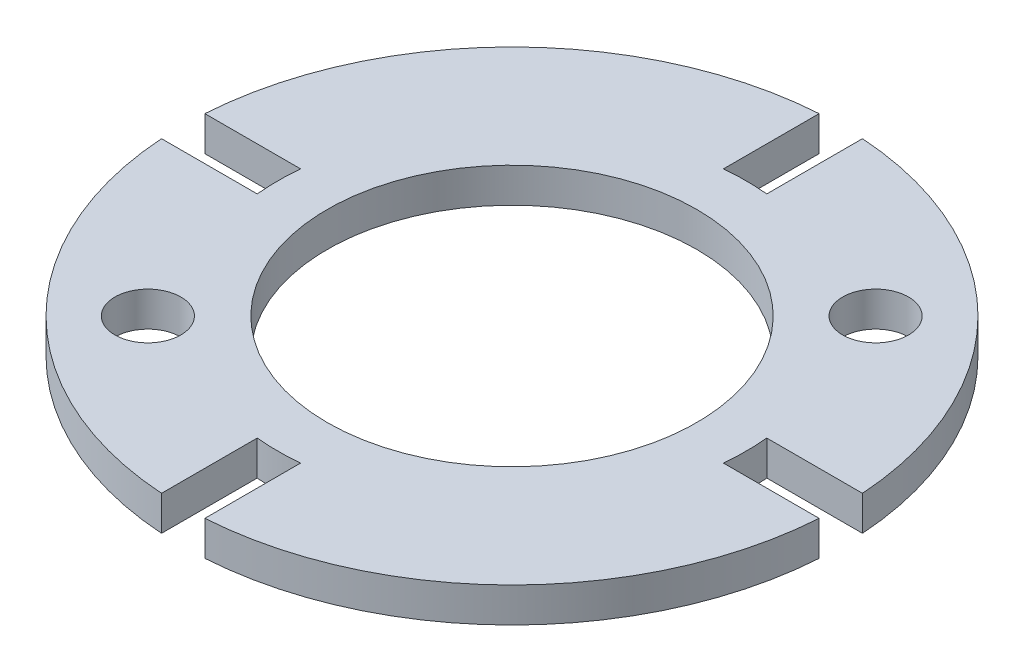
ISO-10303-21;
HEADER;
FILE_DESCRIPTION(('STEP AP214'),'2;1');
FILE_NAME('part.step','',(''),(''),'','','');
FILE_SCHEMA(('AUTOMOTIVE_DESIGN { 1 0 10303 214 1 1 1 1 }'));
ENDSEC;
DATA;
#1=APPLICATION_CONTEXT('core data for automotive mechanical design processes');
#2=APPLICATION_PROTOCOL_DEFINITION('international standard','automotive_design',2000,#1);
#3=PRODUCT_CONTEXT('',#1,'mechanical');
#4=PRODUCT('Part','Part','',(#3));
#5=PRODUCT_RELATED_PRODUCT_CATEGORY('part','',(#4));
#6=PRODUCT_DEFINITION_FORMATION('','',#4);
#7=PRODUCT_DEFINITION_CONTEXT('part definition',#1,'design');
#8=PRODUCT_DEFINITION('design','',#6,#7);
#9=PRODUCT_DEFINITION_SHAPE('','',#8);
#10=(LENGTH_UNIT() NAMED_UNIT(*) SI_UNIT(.MILLI.,.METRE.));
#11=(NAMED_UNIT(*) PLANE_ANGLE_UNIT() SI_UNIT($,.RADIAN.));
#12=(NAMED_UNIT(*) SI_UNIT($,.STERADIAN.) SOLID_ANGLE_UNIT());
#13=UNCERTAINTY_MEASURE_WITH_UNIT(LENGTH_MEASURE(1.E-05),#10,'distance_accuracy_value','');
#14=(GEOMETRIC_REPRESENTATION_CONTEXT(3) GLOBAL_UNCERTAINTY_ASSIGNED_CONTEXT((#13)) GLOBAL_UNIT_ASSIGNED_CONTEXT((#10,
#11,#12)) REPRESENTATION_CONTEXT('',''));
#15=CARTESIAN_POINT('',(0.,0.,0.));
#16=DIRECTION('',(0.,0.,1.));
#17=DIRECTION('',(1.,0.,0.));
#18=AXIS2_PLACEMENT_3D('',#15,#16,#17);
#19=CARTESIAN_POINT('',(0.,5.08,0.));
#20=DIRECTION('',(0.,1.,0.));
#21=DIRECTION('',(0.,0.,1.));
#22=AXIS2_PLACEMENT_3D('',#19,#20,#21);
#23=PLANE('',#22);
#24=CARTESIAN_POINT('',(-26.6652769663793,5.08,26.6652769663792));
#25=DIRECTION('',(0.,1.,0.));
#26=DIRECTION('',(0.,0.,1.));
#27=AXIS2_PLACEMENT_3D('',#24,#25,#26);
#28=CIRCLE('',#27,4.826);
#29=CARTESIAN_POINT('',(-26.6652769663793,5.08,31.4912769663792));
#30=VERTEX_POINT('',#29);
#31=EDGE_CURVE('E295',#30,#30,#28,.T.);
#32=ORIENTED_EDGE('',*,*,#31,.F.);
#33=EDGE_LOOP('',(#32));
#34=FACE_BOUND('',#33,.T.);
#35=CARTESIAN_POINT('',(26.62645939897,5.08,-26.62645939897));
#36=DIRECTION('',(0.,1.,0.));
#37=DIRECTION('',(0.,0.,1.));
#38=AXIS2_PLACEMENT_3D('',#35,#36,#37);
#39=CIRCLE('',#38,4.826);
#40=CARTESIAN_POINT('',(26.62645939897,5.08,-21.80045939897));
#41=VERTEX_POINT('',#40);
#42=EDGE_CURVE('E299',#41,#41,#39,.T.);
#43=ORIENTED_EDGE('',*,*,#42,.F.);
#44=EDGE_LOOP('',(#43));
#45=FACE_BOUND('',#44,.T.);
#46=CARTESIAN_POINT('',(0.,5.08,0.));
#47=DIRECTION('',(0.,1.,0.));
#48=DIRECTION('',(0.,0.,1.));
#49=AXIS2_PLACEMENT_3D('',#46,#47,#48);
#50=CIRCLE('',#49,27.051);
#51=CARTESIAN_POINT('',(0.,5.08,27.051));
#52=VERTEX_POINT('',#51);
#53=EDGE_CURVE('E262',#52,#52,#50,.T.);
#54=ORIENTED_EDGE('',*,*,#53,.F.);
#55=EDGE_LOOP('',(#54));
#56=FACE_BOUND('',#55,.T.);
#57=CARTESIAN_POINT('',(0.,5.08,0.));
#58=DIRECTION('',(0.,1.,0.));
#59=DIRECTION('',(0.,0.,1.));
#60=AXIS2_PLACEMENT_3D('',#57,#58,#59);
#61=CIRCLE('',#60,34.29);
#62=CARTESIAN_POINT('',(-34.142692849276,5.08,-3.17499999999999));
#63=VERTEX_POINT('',#62);
#64=CARTESIAN_POINT('',(-34.142692849276,5.08,3.17499999999999));
#65=VERTEX_POINT('',#64);
#66=EDGE_CURVE('E157',#63,#65,#61,.T.);
#67=ORIENTED_EDGE('',*,*,#66,.T.);
#68=DIRECTION('',(-1.,0.,0.));
#69=VECTOR('',#68,1.);
#70=CARTESIAN_POINT('',(0.,5.08,3.17499999999999));
#71=LINE('',#70,#69);
#72=CARTESIAN_POINT('',(-48.1554459537029,5.08,3.175));
#73=VERTEX_POINT('',#72);
#74=EDGE_CURVE('E171',#65,#73,#71,.T.);
#75=ORIENTED_EDGE('',*,*,#74,.T.);
#76=CARTESIAN_POINT('',(0.,5.08,0.));
#77=DIRECTION('',(0.,1.,0.));
#78=DIRECTION('',(0.,0.,1.));
#79=AXIS2_PLACEMENT_3D('',#76,#77,#78);
#80=CIRCLE('',#79,48.26);
#81=CARTESIAN_POINT('',(-3.17499999999999,5.08,48.1554459537029));
#82=VERTEX_POINT('',#81);
#83=EDGE_CURVE('E45',#73,#82,#80,.T.);
#84=ORIENTED_EDGE('',*,*,#83,.T.);
#85=DIRECTION('',(0.,0.,1.));
#86=VECTOR('',#85,1.);
#87=CARTESIAN_POINT('',(-3.17499999999999,5.08,0.));
#88=LINE('',#87,#86);
#89=CARTESIAN_POINT('',(-3.17499999999999,5.08,34.142692849276));
#90=VERTEX_POINT('',#89);
#91=EDGE_CURVE('E52',#90,#82,#88,.T.);
#92=ORIENTED_EDGE('',*,*,#91,.F.);
#93=CARTESIAN_POINT('',(0.,5.08,0.));
#94=DIRECTION('',(0.,1.,0.));
#95=DIRECTION('',(0.,0.,1.));
#96=AXIS2_PLACEMENT_3D('',#93,#94,#95);
#97=CIRCLE('',#96,34.29);
#98=CARTESIAN_POINT('',(3.17499999999999,5.08,34.142692849276));
#99=VERTEX_POINT('',#98);
#100=EDGE_CURVE('E223',#90,#99,#97,.T.);
#101=ORIENTED_EDGE('',*,*,#100,.T.);
#102=DIRECTION('',(0.,0.,1.));
#103=VECTOR('',#102,1.);
#104=CARTESIAN_POINT('',(3.17499999999999,5.08,0.));
#105=LINE('',#104,#103);
#106=CARTESIAN_POINT('',(3.17499999999999,5.08,48.1554459537029));
#107=VERTEX_POINT('',#106);
#108=EDGE_CURVE('E217',#99,#107,#105,.T.);
#109=ORIENTED_EDGE('',*,*,#108,.T.);
#110=CARTESIAN_POINT('',(48.1554459537029,5.08,3.17499999999999));
#111=VERTEX_POINT('',#110);
#112=EDGE_CURVE('E11',#107,#111,#80,.T.);
#113=ORIENTED_EDGE('',*,*,#112,.T.);
#114=DIRECTION('',(-1.,0.,0.));
#115=VECTOR('',#114,1.);
#116=CARTESIAN_POINT('',(0.,5.08,3.175));
#117=LINE('',#116,#115);
#118=CARTESIAN_POINT('',(34.142692849276,5.08,3.17499999999999));
#119=VERTEX_POINT('',#118);
#120=EDGE_CURVE('E201',#111,#119,#117,.T.);
#121=ORIENTED_EDGE('',*,*,#120,.T.);
#122=CARTESIAN_POINT('',(0.,5.08,0.));
#123=DIRECTION('',(0.,1.,0.));
#124=DIRECTION('',(0.,0.,1.));
#125=AXIS2_PLACEMENT_3D('',#122,#123,#124);
#126=CIRCLE('',#125,34.29);
#127=CARTESIAN_POINT('',(34.142692849276,5.08,-3.17499999999999));
#128=VERTEX_POINT('',#127);
#129=EDGE_CURVE('E198',#119,#128,#126,.T.);
#130=ORIENTED_EDGE('',*,*,#129,.T.);
#131=DIRECTION('',(-1.,0.,0.));
#132=VECTOR('',#131,1.);
#133=CARTESIAN_POINT('',(0.,5.08,-3.175));
#134=LINE('',#133,#132);
#135=CARTESIAN_POINT('',(48.1554459537029,5.08,-3.17499999999999));
#136=VERTEX_POINT('',#135);
#137=EDGE_CURVE('E192',#136,#128,#134,.T.);
#138=ORIENTED_EDGE('',*,*,#137,.F.);
#139=CARTESIAN_POINT('',(3.175,5.08,-48.1554459537029));
#140=VERTEX_POINT('',#139);
#141=EDGE_CURVE('E44',#136,#140,#80,.T.);
#142=ORIENTED_EDGE('',*,*,#141,.T.);
#143=DIRECTION('',(0.,0.,1.));
#144=VECTOR('',#143,1.);
#145=CARTESIAN_POINT('',(3.17499999999999,5.08,0.));
#146=LINE('',#145,#144);
#147=CARTESIAN_POINT('',(3.175,5.08,-34.142692849276));
#148=VERTEX_POINT('',#147);
#149=EDGE_CURVE('E249',#140,#148,#146,.T.);
#150=ORIENTED_EDGE('',*,*,#149,.T.);
#151=CARTESIAN_POINT('',(0.,5.08,0.));
#152=DIRECTION('',(0.,1.,0.));
#153=DIRECTION('',(0.,0.,1.));
#154=AXIS2_PLACEMENT_3D('',#151,#152,#153);
#155=CIRCLE('',#154,34.29);
#156=CARTESIAN_POINT('',(-3.175,5.08,-34.142692849276));
#157=VERTEX_POINT('',#156);
#158=EDGE_CURVE('E246',#148,#157,#155,.T.);
#159=ORIENTED_EDGE('',*,*,#158,.T.);
#160=DIRECTION('',(0.,0.,1.));
#161=VECTOR('',#160,1.);
#162=CARTESIAN_POINT('',(-3.17499999999999,5.08,0.));
#163=LINE('',#162,#161);
#164=CARTESIAN_POINT('',(-3.175,5.08,-48.1554459537029));
#165=VERTEX_POINT('',#164);
#166=EDGE_CURVE('E240',#165,#157,#163,.T.);
#167=ORIENTED_EDGE('',*,*,#166,.F.);
#168=CARTESIAN_POINT('',(-48.1554459537029,5.08,-3.175));
#169=VERTEX_POINT('',#168);
#170=EDGE_CURVE('E307',#165,#169,#80,.T.);
#171=ORIENTED_EDGE('',*,*,#170,.T.);
#172=DIRECTION('',(-1.,0.,0.));
#173=VECTOR('',#172,1.);
#174=CARTESIAN_POINT('',(0.,5.08,-3.17499999999999));
#175=LINE('',#174,#173);
#176=EDGE_CURVE('E60',#63,#169,#175,.T.);
#177=ORIENTED_EDGE('',*,*,#176,.F.);
#178=EDGE_LOOP('',(#67,#75,#84,#92,#101,#109,#113,#121,#130,#138,#142,#150,#159,#167,#171,#177));
#179=FACE_BOUND('',#178,.T.);
#180=ADVANCED_FACE('F35',(#34,#45,#56,#179),#23,.T.);
#181=CARTESIAN_POINT('',(0.,0.,0.));
#182=DIRECTION('',(0.,1.,0.));
#183=DIRECTION('',(0.,0.,1.));
#184=AXIS2_PLACEMENT_3D('',#181,#182,#183);
#185=PLANE('',#184);
#186=CARTESIAN_POINT('',(-26.6652769663793,0.,26.6652769663792));
#187=DIRECTION('',(0.,1.,0.));
#188=DIRECTION('',(0.,0.,1.));
#189=AXIS2_PLACEMENT_3D('',#186,#187,#188);
#190=CIRCLE('',#189,4.826);
#191=CARTESIAN_POINT('',(-26.6652769663793,0.,31.4912769663792));
#192=VERTEX_POINT('',#191);
#193=EDGE_CURVE('E250',#192,#192,#190,.T.);
#194=ORIENTED_EDGE('',*,*,#193,.T.);
#195=EDGE_LOOP('',(#194));
#196=FACE_BOUND('',#195,.T.);
#197=CARTESIAN_POINT('',(26.62645939897,0.,-26.62645939897));
#198=DIRECTION('',(0.,1.,0.));
#199=DIRECTION('',(0.,0.,1.));
#200=AXIS2_PLACEMENT_3D('',#197,#198,#199);
#201=CIRCLE('',#200,4.826);
#202=CARTESIAN_POINT('',(26.62645939897,0.,-21.80045939897));
#203=VERTEX_POINT('',#202);
#204=EDGE_CURVE('E176',#203,#203,#201,.T.);
#205=ORIENTED_EDGE('',*,*,#204,.T.);
#206=EDGE_LOOP('',(#205));
#207=FACE_BOUND('',#206,.T.);
#208=CARTESIAN_POINT('',(0.,0.,0.));
#209=DIRECTION('',(0.,1.,0.));
#210=DIRECTION('',(0.,0.,1.));
#211=AXIS2_PLACEMENT_3D('',#208,#209,#210);
#212=CIRCLE('',#211,27.051);
#213=CARTESIAN_POINT('',(0.,0.,27.051));
#214=VERTEX_POINT('',#213);
#215=EDGE_CURVE('E185',#214,#214,#212,.T.);
#216=ORIENTED_EDGE('',*,*,#215,.T.);
#217=EDGE_LOOP('',(#216));
#218=FACE_BOUND('',#217,.T.);
#219=DIRECTION('',(-1.,0.,0.));
#220=VECTOR('',#219,1.);
#221=CARTESIAN_POINT('',(0.,0.,3.17499999999999));
#222=LINE('',#221,#220);
#223=CARTESIAN_POINT('',(-34.142692849276,0.,3.17499999999999));
#224=VERTEX_POINT('',#223);
#225=CARTESIAN_POINT('',(-48.1554459537029,0.,3.175));
#226=VERTEX_POINT('',#225);
#227=EDGE_CURVE('E159',#224,#226,#222,.T.);
#228=ORIENTED_EDGE('',*,*,#227,.F.);
#229=CARTESIAN_POINT('',(0.,0.,0.));
#230=DIRECTION('',(0.,1.,0.));
#231=DIRECTION('',(0.,0.,1.));
#232=AXIS2_PLACEMENT_3D('',#229,#230,#231);
#233=CIRCLE('',#232,34.29);
#234=CARTESIAN_POINT('',(-34.142692849276,0.,-3.17499999999999));
#235=VERTEX_POINT('',#234);
#236=EDGE_CURVE('E154',#235,#224,#233,.T.);
#237=ORIENTED_EDGE('',*,*,#236,.F.);
#238=DIRECTION('',(-1.,0.,0.));
#239=VECTOR('',#238,1.);
#240=CARTESIAN_POINT('',(0.,0.,-3.17499999999999));
#241=LINE('',#240,#239);
#242=CARTESIAN_POINT('',(-48.1554459537029,0.,-3.175));
#243=VERTEX_POINT('',#242);
#244=EDGE_CURVE('E162',#235,#243,#241,.T.);
#245=ORIENTED_EDGE('',*,*,#244,.T.);
#246=CARTESIAN_POINT('',(0.,0.,0.));
#247=DIRECTION('',(0.,1.,0.));
#248=DIRECTION('',(0.,0.,1.));
#249=AXIS2_PLACEMENT_3D('',#246,#247,#248);
#250=CIRCLE('',#249,48.26);
#251=CARTESIAN_POINT('',(-3.175,0.,-48.1554459537029));
#252=VERTEX_POINT('',#251);
#253=EDGE_CURVE('E316',#252,#243,#250,.T.);
#254=ORIENTED_EDGE('',*,*,#253,.F.);
#255=DIRECTION('',(0.,0.,1.));
#256=VECTOR('',#255,1.);
#257=CARTESIAN_POINT('',(-3.17499999999999,0.,0.));
#258=LINE('',#257,#256);
#259=CARTESIAN_POINT('',(-3.175,0.,-34.142692849276));
#260=VERTEX_POINT('',#259);
#261=EDGE_CURVE('E242',#252,#260,#258,.T.);
#262=ORIENTED_EDGE('',*,*,#261,.T.);
#263=CARTESIAN_POINT('',(0.,0.,0.));
#264=DIRECTION('',(0.,1.,0.));
#265=DIRECTION('',(0.,0.,1.));
#266=AXIS2_PLACEMENT_3D('',#263,#264,#265);
#267=CIRCLE('',#266,34.29);
#268=CARTESIAN_POINT('',(3.175,0.,-34.142692849276));
#269=VERTEX_POINT('',#268);
#270=EDGE_CURVE('E237',#269,#260,#267,.T.);
#271=ORIENTED_EDGE('',*,*,#270,.F.);
#272=DIRECTION('',(0.,0.,1.));
#273=VECTOR('',#272,1.);
#274=CARTESIAN_POINT('',(3.17499999999999,0.,0.));
#275=LINE('',#274,#273);
#276=CARTESIAN_POINT('',(3.175,0.,-48.1554459537029));
#277=VERTEX_POINT('',#276);
#278=EDGE_CURVE('E239',#277,#269,#275,.T.);
#279=ORIENTED_EDGE('',*,*,#278,.F.);
#280=CARTESIAN_POINT('',(48.1554459537029,0.,-3.17499999999999));
#281=VERTEX_POINT('',#280);
#282=EDGE_CURVE('E311',#281,#277,#250,.T.);
#283=ORIENTED_EDGE('',*,*,#282,.F.);
#284=DIRECTION('',(-1.,0.,0.));
#285=VECTOR('',#284,1.);
#286=CARTESIAN_POINT('',(0.,0.,-3.175));
#287=LINE('',#286,#285);
#288=CARTESIAN_POINT('',(34.142692849276,0.,-3.17499999999999));
#289=VERTEX_POINT('',#288);
#290=EDGE_CURVE('E194',#281,#289,#287,.T.);
#291=ORIENTED_EDGE('',*,*,#290,.T.);
#292=CARTESIAN_POINT('',(0.,0.,0.));
#293=DIRECTION('',(0.,1.,0.));
#294=DIRECTION('',(0.,0.,1.));
#295=AXIS2_PLACEMENT_3D('',#292,#293,#294);
#296=CIRCLE('',#295,34.29);
#297=CARTESIAN_POINT('',(34.142692849276,0.,3.17499999999999));
#298=VERTEX_POINT('',#297);
#299=EDGE_CURVE('E189',#298,#289,#296,.T.);
#300=ORIENTED_EDGE('',*,*,#299,.F.);
#301=DIRECTION('',(-1.,0.,0.));
#302=VECTOR('',#301,1.);
#303=CARTESIAN_POINT('',(0.,0.,3.175));
#304=LINE('',#303,#302);
#305=CARTESIAN_POINT('',(48.1554459537029,0.,3.17499999999999));
#306=VERTEX_POINT('',#305);
#307=EDGE_CURVE('E191',#306,#298,#304,.T.);
#308=ORIENTED_EDGE('',*,*,#307,.F.);
#309=CARTESIAN_POINT('',(3.17499999999999,0.,48.1554459537029));
#310=VERTEX_POINT('',#309);
#311=EDGE_CURVE('E39',#310,#306,#250,.T.);
#312=ORIENTED_EDGE('',*,*,#311,.F.);
#313=DIRECTION('',(0.,0.,1.));
#314=VECTOR('',#313,1.);
#315=CARTESIAN_POINT('',(3.17499999999999,0.,0.));
#316=LINE('',#315,#314);
#317=CARTESIAN_POINT('',(3.17499999999999,0.,34.142692849276));
#318=VERTEX_POINT('',#317);
#319=EDGE_CURVE('E220',#318,#310,#316,.T.);
#320=ORIENTED_EDGE('',*,*,#319,.F.);
#321=CARTESIAN_POINT('',(0.,0.,0.));
#322=DIRECTION('',(0.,1.,0.));
#323=DIRECTION('',(0.,0.,1.));
#324=AXIS2_PLACEMENT_3D('',#321,#322,#323);
#325=CIRCLE('',#324,34.29);
#326=CARTESIAN_POINT('',(-3.17499999999999,0.,34.142692849276));
#327=VERTEX_POINT('',#326);
#328=EDGE_CURVE('E214',#327,#318,#325,.T.);
#329=ORIENTED_EDGE('',*,*,#328,.F.);
#330=DIRECTION('',(0.,0.,1.));
#331=VECTOR('',#330,1.);
#332=CARTESIAN_POINT('',(-3.17499999999999,0.,0.));
#333=LINE('',#332,#331);
#334=CARTESIAN_POINT('',(-3.17499999999999,0.,48.1554459537029));
#335=VERTEX_POINT('',#334);
#336=EDGE_CURVE('E216',#327,#335,#333,.T.);
#337=ORIENTED_EDGE('',*,*,#336,.T.);
#338=EDGE_CURVE('E265',#226,#335,#250,.T.);
#339=ORIENTED_EDGE('',*,*,#338,.F.);
#340=EDGE_LOOP('',(#228,#237,#245,#254,#262,#271,#279,#283,#291,#300,#308,#312,#320,#329,#337,#339));
#341=FACE_BOUND('',#340,.T.);
#342=ADVANCED_FACE('F169',(#196,#207,#218,#341),#185,.F.);
#343=CARTESIAN_POINT('',(0.,5.08,0.));
#344=DIRECTION('',(0.,-1.,0.));
#345=DIRECTION('',(0.,0.,-1.));
#346=AXIS2_PLACEMENT_3D('',#343,#344,#345);
#347=CYLINDRICAL_SURFACE('',#346,48.26);
#348=DIRECTION('',(0.,1.,0.));
#349=VECTOR('',#348,1.);
#350=CARTESIAN_POINT('',(-48.1554459537029,0.,3.175));
#351=LINE('',#350,#349);
#352=EDGE_CURVE('E186',#226,#73,#351,.T.);
#353=ORIENTED_EDGE('',*,*,#352,.F.);
#354=ORIENTED_EDGE('',*,*,#338,.T.);
#355=DIRECTION('',(0.,1.,0.));
#356=VECTOR('',#355,1.);
#357=CARTESIAN_POINT('',(-3.17499999999999,0.,48.1554459537029));
#358=LINE('',#357,#356);
#359=EDGE_CURVE('E234',#335,#82,#358,.T.);
#360=ORIENTED_EDGE('',*,*,#359,.T.);
#361=ORIENTED_EDGE('',*,*,#83,.F.);
#362=EDGE_LOOP('',(#353,#354,#360,#361));
#363=FACE_BOUND('',#362,.T.);
#364=ADVANCED_FACE('F284',(#363),#347,.T.);
#365=DIRECTION('',(0.,1.,0.));
#366=VECTOR('',#365,1.);
#367=CARTESIAN_POINT('',(48.1554459537029,0.,3.17499999999999));
#368=LINE('',#367,#366);
#369=EDGE_CURVE('E210',#306,#111,#368,.T.);
#370=ORIENTED_EDGE('',*,*,#369,.T.);
#371=ORIENTED_EDGE('',*,*,#112,.F.);
#372=DIRECTION('',(0.,1.,0.));
#373=VECTOR('',#372,1.);
#374=CARTESIAN_POINT('',(3.17499999999999,0.,48.1554459537029));
#375=LINE('',#374,#373);
#376=EDGE_CURVE('E232',#310,#107,#375,.T.);
#377=ORIENTED_EDGE('',*,*,#376,.F.);
#378=ORIENTED_EDGE('',*,*,#311,.T.);
#379=EDGE_LOOP('',(#370,#371,#377,#378));
#380=FACE_BOUND('',#379,.T.);
#381=ADVANCED_FACE('F346',(#380),#347,.T.);
#382=ORIENTED_EDGE('',*,*,#141,.F.);
#383=DIRECTION('',(0.,1.,0.));
#384=VECTOR('',#383,1.);
#385=CARTESIAN_POINT('',(48.1554459537029,0.,-3.17499999999999));
#386=LINE('',#385,#384);
#387=EDGE_CURVE('E208',#281,#136,#386,.T.);
#388=ORIENTED_EDGE('',*,*,#387,.F.);
#389=ORIENTED_EDGE('',*,*,#282,.T.);
#390=DIRECTION('',(0.,1.,0.));
#391=VECTOR('',#390,1.);
#392=CARTESIAN_POINT('',(3.175,0.,-48.1554459537029));
#393=LINE('',#392,#391);
#394=EDGE_CURVE('E258',#277,#140,#393,.T.);
#395=ORIENTED_EDGE('',*,*,#394,.T.);
#396=EDGE_LOOP('',(#382,#388,#389,#395));
#397=FACE_BOUND('',#396,.T.);
#398=ADVANCED_FACE('F282',(#397),#347,.T.);
#399=ORIENTED_EDGE('',*,*,#253,.T.);
#400=DIRECTION('',(0.,1.,0.));
#401=VECTOR('',#400,1.);
#402=CARTESIAN_POINT('',(-48.1554459537029,0.,-3.175));
#403=LINE('',#402,#401);
#404=EDGE_CURVE('E158',#243,#169,#403,.T.);
#405=ORIENTED_EDGE('',*,*,#404,.T.);
#406=ORIENTED_EDGE('',*,*,#170,.F.);
#407=DIRECTION('',(0.,1.,0.));
#408=VECTOR('',#407,1.);
#409=CARTESIAN_POINT('',(-3.175,0.,-48.1554459537029));
#410=LINE('',#409,#408);
#411=EDGE_CURVE('E256',#252,#165,#410,.T.);
#412=ORIENTED_EDGE('',*,*,#411,.F.);
#413=EDGE_LOOP('',(#399,#405,#406,#412));
#414=FACE_BOUND('',#413,.T.);
#415=ADVANCED_FACE('F37',(#414),#347,.T.);
#416=CARTESIAN_POINT('',(0.,5.08,0.));
#417=DIRECTION('',(0.,-1.,0.));
#418=DIRECTION('',(0.,0.,-1.));
#419=AXIS2_PLACEMENT_3D('',#416,#417,#418);
#420=CYLINDRICAL_SURFACE('',#419,27.051);
#421=ORIENTED_EDGE('',*,*,#53,.T.);
#422=EDGE_LOOP('',(#421));
#423=FACE_BOUND('',#422,.T.);
#424=ORIENTED_EDGE('',*,*,#215,.F.);
#425=EDGE_LOOP('',(#424));
#426=FACE_BOUND('',#425,.T.);
#427=ADVANCED_FACE('F270',(#423,#426),#420,.F.);
#428=CARTESIAN_POINT('',(0.,0.,0.));
#429=DIRECTION('',(0.,1.,0.));
#430=DIRECTION('',(0.,0.,1.));
#431=AXIS2_PLACEMENT_3D('',#428,#429,#430);
#432=CYLINDRICAL_SURFACE('',#431,34.29);
#433=ORIENTED_EDGE('',*,*,#158,.F.);
#434=DIRECTION('',(0.,1.,0.));
#435=VECTOR('',#434,1.);
#436=CARTESIAN_POINT('',(3.175,0.,-34.142692849276));
#437=LINE('',#436,#435);
#438=EDGE_CURVE('E245',#269,#148,#437,.T.);
#439=ORIENTED_EDGE('',*,*,#438,.F.);
#440=ORIENTED_EDGE('',*,*,#270,.T.);
#441=DIRECTION('',(0.,1.,0.));
#442=VECTOR('',#441,1.);
#443=CARTESIAN_POINT('',(-3.175,0.,-34.142692849276));
#444=LINE('',#443,#442);
#445=EDGE_CURVE('E226',#260,#157,#444,.T.);
#446=ORIENTED_EDGE('',*,*,#445,.T.);
#447=EDGE_LOOP('',(#433,#439,#440,#446));
#448=FACE_BOUND('',#447,.T.);
#449=ADVANCED_FACE('F272',(#448),#432,.T.);
#450=CARTESIAN_POINT('',(-3.17499999999999,0.,0.));
#451=DIRECTION('',(-1.,0.,0.));
#452=DIRECTION('',(0.,0.,1.));
#453=AXIS2_PLACEMENT_3D('',#450,#451,#452);
#454=PLANE('',#453);
#455=ORIENTED_EDGE('',*,*,#166,.T.);
#456=ORIENTED_EDGE('',*,*,#445,.F.);
#457=ORIENTED_EDGE('',*,*,#261,.F.);
#458=ORIENTED_EDGE('',*,*,#411,.T.);
#459=EDGE_LOOP('',(#455,#456,#457,#458));
#460=FACE_BOUND('',#459,.T.);
#461=ADVANCED_FACE('F279',(#460),#454,.F.);
#462=CARTESIAN_POINT('',(3.17499999999999,0.,0.));
#463=DIRECTION('',(-1.,0.,0.));
#464=DIRECTION('',(0.,0.,1.));
#465=AXIS2_PLACEMENT_3D('',#462,#463,#464);
#466=PLANE('',#465);
#467=ORIENTED_EDGE('',*,*,#149,.F.);
#468=ORIENTED_EDGE('',*,*,#394,.F.);
#469=ORIENTED_EDGE('',*,*,#278,.T.);
#470=ORIENTED_EDGE('',*,*,#438,.T.);
#471=EDGE_LOOP('',(#467,#468,#469,#470));
#472=FACE_BOUND('',#471,.T.);
#473=ADVANCED_FACE('F327',(#472),#466,.T.);
#474=CARTESIAN_POINT('',(0.,0.,0.));
#475=DIRECTION('',(0.,1.,0.));
#476=DIRECTION('',(0.,0.,1.));
#477=AXIS2_PLACEMENT_3D('',#474,#475,#476);
#478=CYLINDRICAL_SURFACE('',#477,34.29);
#479=ORIENTED_EDGE('',*,*,#100,.F.);
#480=DIRECTION('',(0.,1.,0.));
#481=VECTOR('',#480,1.);
#482=CARTESIAN_POINT('',(-3.17499999999999,0.,34.142692849276));
#483=LINE('',#482,#481);
#484=EDGE_CURVE('E222',#327,#90,#483,.T.);
#485=ORIENTED_EDGE('',*,*,#484,.F.);
#486=ORIENTED_EDGE('',*,*,#328,.T.);
#487=DIRECTION('',(0.,1.,0.));
#488=VECTOR('',#487,1.);
#489=CARTESIAN_POINT('',(3.17499999999999,0.,34.142692849276));
#490=LINE('',#489,#488);
#491=EDGE_CURVE('E202',#318,#99,#490,.T.);
#492=ORIENTED_EDGE('',*,*,#491,.T.);
#493=EDGE_LOOP('',(#479,#485,#486,#492));
#494=FACE_BOUND('',#493,.T.);
#495=ADVANCED_FACE('F352',(#494),#478,.T.);
#496=CARTESIAN_POINT('',(3.17499999999999,0.,0.));
#497=DIRECTION('',(-1.,0.,0.));
#498=DIRECTION('',(0.,0.,1.));
#499=AXIS2_PLACEMENT_3D('',#496,#497,#498);
#500=PLANE('',#499);
#501=ORIENTED_EDGE('',*,*,#108,.F.);
#502=ORIENTED_EDGE('',*,*,#491,.F.);
#503=ORIENTED_EDGE('',*,*,#319,.T.);
#504=ORIENTED_EDGE('',*,*,#376,.T.);
#505=EDGE_LOOP('',(#501,#502,#503,#504));
#506=FACE_BOUND('',#505,.T.);
#507=ADVANCED_FACE('F350',(#506),#500,.T.);
#508=CARTESIAN_POINT('',(-3.17499999999999,0.,0.));
#509=DIRECTION('',(-1.,0.,0.));
#510=DIRECTION('',(0.,0.,1.));
#511=AXIS2_PLACEMENT_3D('',#508,#509,#510);
#512=PLANE('',#511);
#513=ORIENTED_EDGE('',*,*,#91,.T.);
#514=ORIENTED_EDGE('',*,*,#359,.F.);
#515=ORIENTED_EDGE('',*,*,#336,.F.);
#516=ORIENTED_EDGE('',*,*,#484,.T.);
#517=EDGE_LOOP('',(#513,#514,#515,#516));
#518=FACE_BOUND('',#517,.T.);
#519=ADVANCED_FACE('F355',(#518),#512,.F.);
#520=CARTESIAN_POINT('',(0.,0.,0.));
#521=DIRECTION('',(0.,1.,0.));
#522=DIRECTION('',(0.,0.,1.));
#523=AXIS2_PLACEMENT_3D('',#520,#521,#522);
#524=CYLINDRICAL_SURFACE('',#523,34.29);
#525=ORIENTED_EDGE('',*,*,#129,.F.);
#526=DIRECTION('',(0.,1.,0.));
#527=VECTOR('',#526,1.);
#528=CARTESIAN_POINT('',(34.142692849276,0.,3.17499999999999));
#529=LINE('',#528,#527);
#530=EDGE_CURVE('E197',#298,#119,#529,.T.);
#531=ORIENTED_EDGE('',*,*,#530,.F.);
#532=ORIENTED_EDGE('',*,*,#299,.T.);
#533=DIRECTION('',(0.,1.,0.));
#534=VECTOR('',#533,1.);
#535=CARTESIAN_POINT('',(34.142692849276,0.,-3.17499999999999));
#536=LINE('',#535,#534);
#537=EDGE_CURVE('E181',#289,#128,#536,.T.);
#538=ORIENTED_EDGE('',*,*,#537,.T.);
#539=EDGE_LOOP('',(#525,#531,#532,#538));
#540=FACE_BOUND('',#539,.T.);
#541=ADVANCED_FACE('F339',(#540),#524,.T.);
#542=CARTESIAN_POINT('',(0.,0.,-3.175));
#543=DIRECTION('',(0.,0.,-1.));
#544=DIRECTION('',(-1.,0.,0.));
#545=AXIS2_PLACEMENT_3D('',#542,#543,#544);
#546=PLANE('',#545);
#547=ORIENTED_EDGE('',*,*,#137,.T.);
#548=ORIENTED_EDGE('',*,*,#537,.F.);
#549=ORIENTED_EDGE('',*,*,#290,.F.);
#550=ORIENTED_EDGE('',*,*,#387,.T.);
#551=EDGE_LOOP('',(#547,#548,#549,#550));
#552=FACE_BOUND('',#551,.T.);
#553=ADVANCED_FACE('F334',(#552),#546,.F.);
#554=CARTESIAN_POINT('',(0.,0.,3.175));
#555=DIRECTION('',(0.,0.,-1.));
#556=DIRECTION('',(-1.,0.,0.));
#557=AXIS2_PLACEMENT_3D('',#554,#555,#556);
#558=PLANE('',#557);
#559=ORIENTED_EDGE('',*,*,#120,.F.);
#560=ORIENTED_EDGE('',*,*,#369,.F.);
#561=ORIENTED_EDGE('',*,*,#307,.T.);
#562=ORIENTED_EDGE('',*,*,#530,.T.);
#563=EDGE_LOOP('',(#559,#560,#561,#562));
#564=FACE_BOUND('',#563,.T.);
#565=ADVANCED_FACE('F344',(#564),#558,.T.);
#566=CARTESIAN_POINT('',(0.,0.,0.));
#567=DIRECTION('',(0.,1.,0.));
#568=DIRECTION('',(0.,0.,1.));
#569=AXIS2_PLACEMENT_3D('',#566,#567,#568);
#570=CYLINDRICAL_SURFACE('',#569,34.29);
#571=ORIENTED_EDGE('',*,*,#66,.F.);
#572=DIRECTION('',(0.,1.,0.));
#573=VECTOR('',#572,1.);
#574=CARTESIAN_POINT('',(-34.142692849276,0.,-3.17499999999999));
#575=LINE('',#574,#573);
#576=EDGE_CURVE('E149',#235,#63,#575,.T.);
#577=ORIENTED_EDGE('',*,*,#576,.F.);
#578=ORIENTED_EDGE('',*,*,#236,.T.);
#579=DIRECTION('',(0.,1.,0.));
#580=VECTOR('',#579,1.);
#581=CARTESIAN_POINT('',(-34.142692849276,0.,3.17499999999999));
#582=LINE('',#581,#580);
#583=EDGE_CURVE('E183',#224,#65,#582,.T.);
#584=ORIENTED_EDGE('',*,*,#583,.T.);
#585=EDGE_LOOP('',(#571,#577,#578,#584));
#586=FACE_BOUND('',#585,.T.);
#587=ADVANCED_FACE('F151',(#586),#570,.T.);
#588=CARTESIAN_POINT('',(0.,0.,3.17499999999999));
#589=DIRECTION('',(0.,0.,-1.));
#590=DIRECTION('',(-1.,0.,0.));
#591=AXIS2_PLACEMENT_3D('',#588,#589,#590);
#592=PLANE('',#591);
#593=ORIENTED_EDGE('',*,*,#74,.F.);
#594=ORIENTED_EDGE('',*,*,#583,.F.);
#595=ORIENTED_EDGE('',*,*,#227,.T.);
#596=ORIENTED_EDGE('',*,*,#352,.T.);
#597=EDGE_LOOP('',(#593,#594,#595,#596));
#598=FACE_BOUND('',#597,.T.);
#599=ADVANCED_FACE('F357',(#598),#592,.T.);
#600=CARTESIAN_POINT('',(0.,0.,-3.17499999999999));
#601=DIRECTION('',(0.,0.,-1.));
#602=DIRECTION('',(-1.,0.,0.));
#603=AXIS2_PLACEMENT_3D('',#600,#601,#602);
#604=PLANE('',#603);
#605=ORIENTED_EDGE('',*,*,#176,.T.);
#606=ORIENTED_EDGE('',*,*,#404,.F.);
#607=ORIENTED_EDGE('',*,*,#244,.F.);
#608=ORIENTED_EDGE('',*,*,#576,.T.);
#609=EDGE_LOOP('',(#605,#606,#607,#608));
#610=FACE_BOUND('',#609,.T.);
#611=ADVANCED_FACE('F163',(#610),#604,.F.);
#612=CARTESIAN_POINT('',(26.62645939897,0.,-26.62645939897));
#613=DIRECTION('',(0.,1.,0.));
#614=DIRECTION('',(0.,0.,1.));
#615=AXIS2_PLACEMENT_3D('',#612,#613,#614);
#616=CYLINDRICAL_SURFACE('',#615,4.826);
#617=ORIENTED_EDGE('',*,*,#204,.F.);
#618=EDGE_LOOP('',(#617));
#619=FACE_BOUND('',#618,.T.);
#620=ORIENTED_EDGE('',*,*,#42,.T.);
#621=EDGE_LOOP('',(#620));
#622=FACE_BOUND('',#621,.T.);
#623=ADVANCED_FACE('F364',(#619,#622),#616,.F.);
#624=CARTESIAN_POINT('',(-26.6652769663793,0.,26.6652769663792));
#625=DIRECTION('',(0.,1.,0.));
#626=DIRECTION('',(0.,0.,1.));
#627=AXIS2_PLACEMENT_3D('',#624,#625,#626);
#628=CYLINDRICAL_SURFACE('',#627,4.826);
#629=ORIENTED_EDGE('',*,*,#193,.F.);
#630=EDGE_LOOP('',(#629));
#631=FACE_BOUND('',#630,.T.);
#632=ORIENTED_EDGE('',*,*,#31,.T.);
#633=EDGE_LOOP('',(#632));
#634=FACE_BOUND('',#633,.T.);
#635=ADVANCED_FACE('F449',(#631,#634),#628,.F.);
#636=CLOSED_SHELL('',(#180,#342,#364,#381,#398,#415,#427,#449,#461,#473,#495,#507,#519,#541,
#553,#565,#587,#599,#611,#623,#635));
#637=MANIFOLD_SOLID_BREP('B2',#636);
#638=ADVANCED_BREP_SHAPE_REPRESENTATION('',(#18,#637),#14);
#639=SHAPE_DEFINITION_REPRESENTATION(#9,#638);
ENDSEC;
END-ISO-10303-21;
